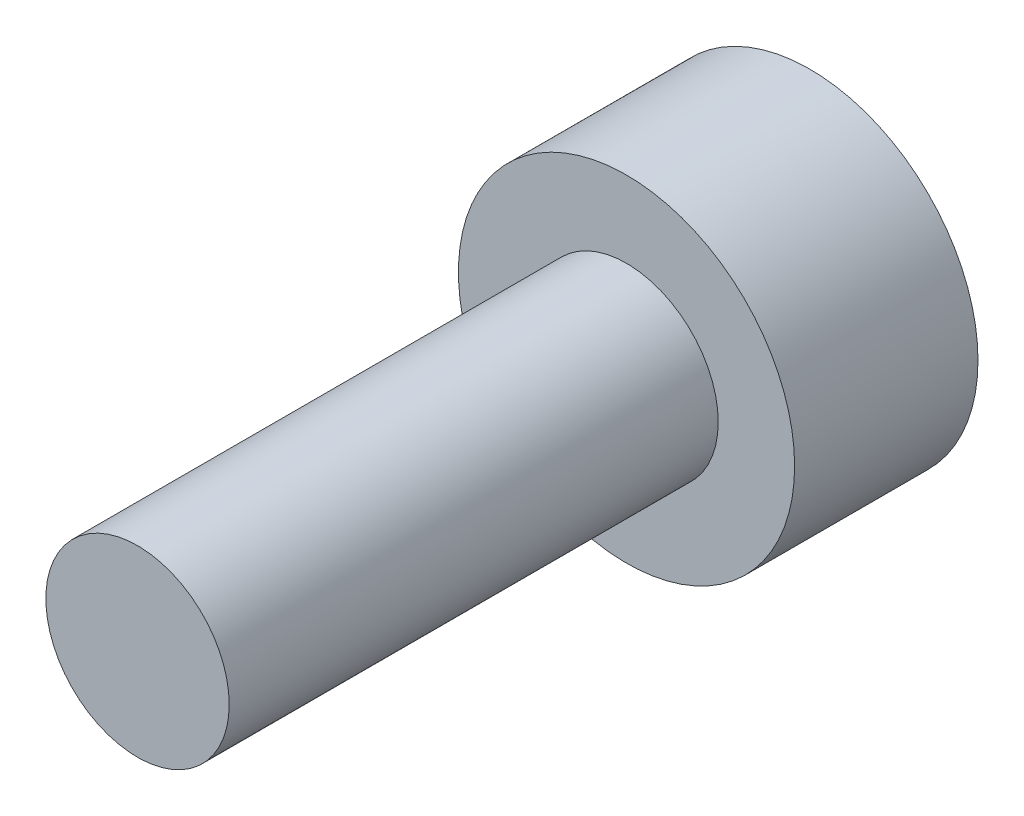
ISO-10303-21;
HEADER;
FILE_DESCRIPTION(('STEP AP214'),'2;1');
FILE_NAME('part.step','',(''),(''),'','','');
FILE_SCHEMA(('AUTOMOTIVE_DESIGN { 1 0 10303 214 1 1 1 1 }'));
ENDSEC;
DATA;
#1=APPLICATION_CONTEXT('core data for automotive mechanical design processes');
#2=APPLICATION_PROTOCOL_DEFINITION('international standard','automotive_design',2000,#1);
#3=PRODUCT_CONTEXT('',#1,'mechanical');
#4=PRODUCT('Part','Part','',(#3));
#5=PRODUCT_RELATED_PRODUCT_CATEGORY('part','',(#4));
#6=PRODUCT_DEFINITION_FORMATION('','',#4);
#7=PRODUCT_DEFINITION_CONTEXT('part definition',#1,'design');
#8=PRODUCT_DEFINITION('design','',#6,#7);
#9=PRODUCT_DEFINITION_SHAPE('','',#8);
#10=(LENGTH_UNIT() NAMED_UNIT(*) SI_UNIT(.MILLI.,.METRE.));
#11=(NAMED_UNIT(*) PLANE_ANGLE_UNIT() SI_UNIT($,.RADIAN.));
#12=(NAMED_UNIT(*) SI_UNIT($,.STERADIAN.) SOLID_ANGLE_UNIT());
#13=UNCERTAINTY_MEASURE_WITH_UNIT(LENGTH_MEASURE(1.E-05),#10,'distance_accuracy_value','');
#14=(GEOMETRIC_REPRESENTATION_CONTEXT(3) GLOBAL_UNCERTAINTY_ASSIGNED_CONTEXT((#13)) GLOBAL_UNIT_ASSIGNED_CONTEXT((#10,
#11,#12)) REPRESENTATION_CONTEXT('',''));
#15=CARTESIAN_POINT('',(0.,0.,0.));
#16=DIRECTION('',(0.,0.,1.));
#17=DIRECTION('',(1.,0.,0.));
#18=AXIS2_PLACEMENT_3D('',#15,#16,#17);
#19=CARTESIAN_POINT('',(0.,0.,3.));
#20=DIRECTION('',(0.,0.,-1.));
#21=DIRECTION('',(-1.,0.,0.));
#22=AXIS2_PLACEMENT_3D('',#19,#20,#21);
#23=CYLINDRICAL_SURFACE('',#22,2.75);
#24=CARTESIAN_POINT('',(0.,0.,3.));
#25=DIRECTION('',(0.,0.,1.));
#26=DIRECTION('',(1.,0.,0.));
#27=AXIS2_PLACEMENT_3D('',#24,#25,#26);
#28=CIRCLE('',#27,2.75);
#29=CARTESIAN_POINT('',(2.75,0.,3.));
#30=VERTEX_POINT('',#29);
#31=EDGE_CURVE('E40',#30,#30,#28,.T.);
#32=ORIENTED_EDGE('',*,*,#31,.F.);
#33=EDGE_LOOP('',(#32));
#34=FACE_BOUND('',#33,.T.);
#35=CARTESIAN_POINT('',(0.,0.,0.));
#36=DIRECTION('',(0.,0.,1.));
#37=DIRECTION('',(1.,0.,0.));
#38=AXIS2_PLACEMENT_3D('',#35,#36,#37);
#39=CIRCLE('',#38,2.75);
#40=CARTESIAN_POINT('',(2.75,0.,0.));
#41=VERTEX_POINT('',#40);
#42=EDGE_CURVE('E36',#41,#41,#39,.T.);
#43=ORIENTED_EDGE('',*,*,#42,.T.);
#44=EDGE_LOOP('',(#43));
#45=FACE_BOUND('',#44,.T.);
#46=ADVANCED_FACE('F33',(#34,#45),#23,.T.);
#47=CARTESIAN_POINT('',(0.,0.,3.));
#48=DIRECTION('',(0.,0.,1.));
#49=DIRECTION('',(1.,0.,0.));
#50=AXIS2_PLACEMENT_3D('',#47,#48,#49);
#51=PLANE('',#50);
#52=CARTESIAN_POINT('',(0.,0.,3.));
#53=DIRECTION('',(0.,0.,1.));
#54=DIRECTION('',(1.,0.,0.));
#55=AXIS2_PLACEMENT_3D('',#52,#53,#54);
#56=CIRCLE('',#55,1.5);
#57=CARTESIAN_POINT('',(1.5,0.,3.));
#58=VERTEX_POINT('',#57);
#59=EDGE_CURVE('E10',#58,#58,#56,.T.);
#60=ORIENTED_EDGE('',*,*,#59,.F.);
#61=EDGE_LOOP('',(#60));
#62=FACE_BOUND('',#61,.T.);
#63=ORIENTED_EDGE('',*,*,#31,.T.);
#64=EDGE_LOOP('',(#63));
#65=FACE_BOUND('',#64,.T.);
#66=ADVANCED_FACE('F57',(#62,#65),#51,.T.);
#67=CARTESIAN_POINT('',(0.,0.,0.));
#68=DIRECTION('',(0.,0.,1.));
#69=DIRECTION('',(1.,0.,0.));
#70=AXIS2_PLACEMENT_3D('',#67,#68,#69);
#71=PLANE('',#70);
#72=ORIENTED_EDGE('',*,*,#42,.F.);
#73=EDGE_LOOP('',(#72));
#74=FACE_BOUND('',#73,.T.);
#75=ADVANCED_FACE('F54',(#74),#71,.F.);
#76=CARTESIAN_POINT('',(0.,0.,11.));
#77=DIRECTION('',(0.,0.,-1.));
#78=DIRECTION('',(-1.,0.,0.));
#79=AXIS2_PLACEMENT_3D('',#76,#77,#78);
#80=CYLINDRICAL_SURFACE('',#79,1.5);
#81=CARTESIAN_POINT('',(0.,0.,11.));
#82=DIRECTION('',(0.,0.,1.));
#83=DIRECTION('',(1.,0.,0.));
#84=AXIS2_PLACEMENT_3D('',#81,#82,#83);
#85=CIRCLE('',#84,1.5);
#86=CARTESIAN_POINT('',(1.5,0.,11.));
#87=VERTEX_POINT('',#86);
#88=EDGE_CURVE('E46',#87,#87,#85,.T.);
#89=ORIENTED_EDGE('',*,*,#88,.F.);
#90=EDGE_LOOP('',(#89));
#91=FACE_BOUND('',#90,.T.);
#92=ORIENTED_EDGE('',*,*,#59,.T.);
#93=EDGE_LOOP('',(#92));
#94=FACE_BOUND('',#93,.T.);
#95=ADVANCED_FACE('F56',(#91,#94),#80,.T.);
#96=CARTESIAN_POINT('',(0.,0.,11.));
#97=DIRECTION('',(0.,0.,1.));
#98=DIRECTION('',(1.,0.,0.));
#99=AXIS2_PLACEMENT_3D('',#96,#97,#98);
#100=PLANE('',#99);
#101=ORIENTED_EDGE('',*,*,#88,.T.);
#102=EDGE_LOOP('',(#101));
#103=FACE_BOUND('',#102,.T.);
#104=ADVANCED_FACE('F62',(#103),#100,.T.);
#105=CLOSED_SHELL('',(#46,#66,#75,#95,#104));
#106=MANIFOLD_SOLID_BREP('B2',#105);
#107=ADVANCED_BREP_SHAPE_REPRESENTATION('',(#18,#106),#14);
#108=SHAPE_DEFINITION_REPRESENTATION(#9,#107);
ENDSEC;
END-ISO-10303-21;
